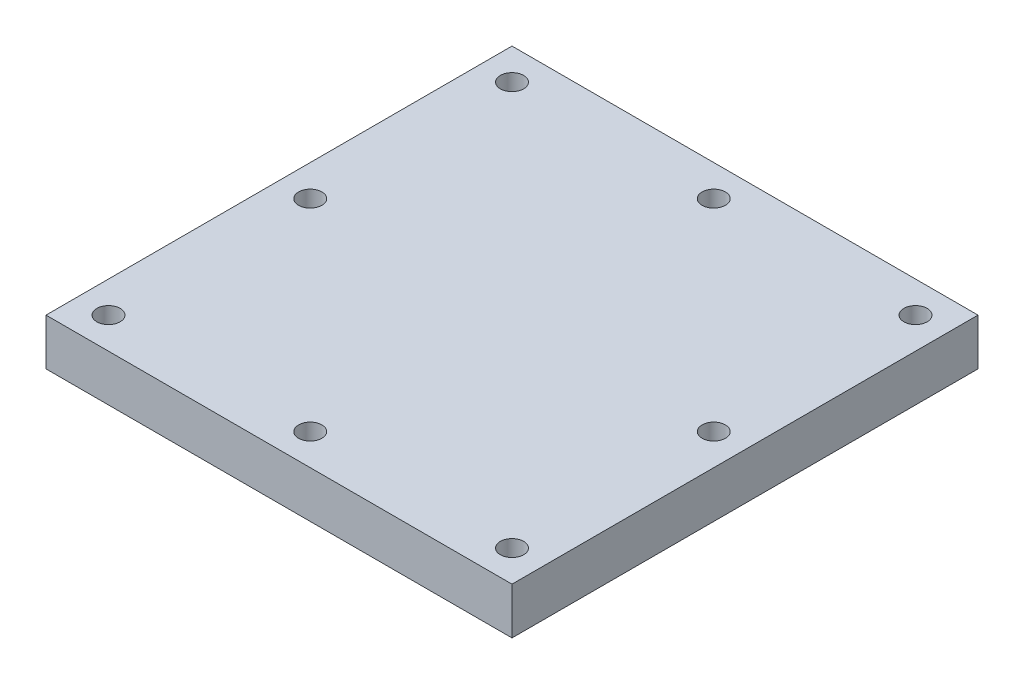
ISO-10303-21;
HEADER;
FILE_DESCRIPTION(('STEP AP214'),'2;1');
FILE_NAME('part.step','',(''),(''),'','','');
FILE_SCHEMA(('AUTOMOTIVE_DESIGN { 1 0 10303 214 1 1 1 1 }'));
ENDSEC;
DATA;
#1=APPLICATION_CONTEXT('core data for automotive mechanical design processes');
#2=APPLICATION_PROTOCOL_DEFINITION('international standard','automotive_design',2000,#1);
#3=PRODUCT_CONTEXT('',#1,'mechanical');
#4=PRODUCT('Part','Part','',(#3));
#5=PRODUCT_RELATED_PRODUCT_CATEGORY('part','',(#4));
#6=PRODUCT_DEFINITION_FORMATION('','',#4);
#7=PRODUCT_DEFINITION_CONTEXT('part definition',#1,'design');
#8=PRODUCT_DEFINITION('design','',#6,#7);
#9=PRODUCT_DEFINITION_SHAPE('','',#8);
#10=(LENGTH_UNIT() NAMED_UNIT(*) SI_UNIT(.MILLI.,.METRE.));
#11=(NAMED_UNIT(*) PLANE_ANGLE_UNIT() SI_UNIT($,.RADIAN.));
#12=(NAMED_UNIT(*) SI_UNIT($,.STERADIAN.) SOLID_ANGLE_UNIT());
#13=UNCERTAINTY_MEASURE_WITH_UNIT(LENGTH_MEASURE(1.E-05),#10,'distance_accuracy_value','');
#14=(GEOMETRIC_REPRESENTATION_CONTEXT(3) GLOBAL_UNCERTAINTY_ASSIGNED_CONTEXT((#13)) GLOBAL_UNIT_ASSIGNED_CONTEXT((#10,
#11,#12)) REPRESENTATION_CONTEXT('',''));
#15=CARTESIAN_POINT('',(0.,0.,0.));
#16=DIRECTION('',(0.,0.,1.));
#17=DIRECTION('',(1.,0.,0.));
#18=AXIS2_PLACEMENT_3D('',#15,#16,#17);
#19=CARTESIAN_POINT('',(0.,100.,0.));
#20=DIRECTION('',(0.,-1.,0.));
#21=DIRECTION('',(0.,0.,-1.));
#22=AXIS2_PLACEMENT_3D('',#19,#20,#21);
#23=PLANE('',#22);
#24=DIRECTION('',(0.,0.,-1.));
#25=VECTOR('',#24,1.);
#26=CARTESIAN_POINT('',(500.,100.,500.));
#27=LINE('',#26,#25);
#28=CARTESIAN_POINT('',(500.,100.,500.));
#29=VERTEX_POINT('',#28);
#30=CARTESIAN_POINT('',(500.,100.,-500.));
#31=VERTEX_POINT('',#30);
#32=EDGE_CURVE('E86',#29,#31,#27,.T.);
#33=ORIENTED_EDGE('',*,*,#32,.T.);
#34=DIRECTION('',(-1.,0.,0.));
#35=VECTOR('',#34,1.);
#36=CARTESIAN_POINT('',(-500.,100.,-500.));
#37=LINE('',#36,#35);
#38=CARTESIAN_POINT('',(-500.,100.,-500.));
#39=VERTEX_POINT('',#38);
#40=EDGE_CURVE('E81',#31,#39,#37,.T.);
#41=ORIENTED_EDGE('',*,*,#40,.T.);
#42=DIRECTION('',(0.,0.,1.));
#43=VECTOR('',#42,1.);
#44=CARTESIAN_POINT('',(-500.,100.,500.));
#45=LINE('',#44,#43);
#46=CARTESIAN_POINT('',(-500.,100.,500.));
#47=VERTEX_POINT('',#46);
#48=EDGE_CURVE('E84',#39,#47,#45,.T.);
#49=ORIENTED_EDGE('',*,*,#48,.T.);
#50=DIRECTION('',(1.,0.,0.));
#51=VECTOR('',#50,1.);
#52=CARTESIAN_POINT('',(-500.,100.,500.));
#53=LINE('',#52,#51);
#54=EDGE_CURVE('E51',#47,#29,#53,.T.);
#55=ORIENTED_EDGE('',*,*,#54,.T.);
#56=EDGE_LOOP('',(#33,#41,#49,#55));
#57=FACE_BOUND('',#56,.T.);
#58=CARTESIAN_POINT('',(432.951482479784,100.,-432.951482479784));
#59=DIRECTION('',(0.,1.,0.));
#60=DIRECTION('',(0.,0.,1.));
#61=AXIS2_PLACEMENT_3D('',#58,#59,#60);
#62=CIRCLE('',#61,25.);
#63=CARTESIAN_POINT('',(432.951482479784,100.,-407.951482479784));
#64=VERTEX_POINT('',#63);
#65=EDGE_CURVE('E101',#64,#64,#62,.T.);
#66=ORIENTED_EDGE('',*,*,#65,.F.);
#67=EDGE_LOOP('',(#66));
#68=FACE_BOUND('',#67,.T.);
#69=CARTESIAN_POINT('',(-432.951482479784,100.,-432.951482479784));
#70=DIRECTION('',(0.,1.,0.));
#71=DIRECTION('',(0.,0.,1.));
#72=AXIS2_PLACEMENT_3D('',#69,#70,#71);
#73=CIRCLE('',#72,25.);
#74=CARTESIAN_POINT('',(-432.951482479784,100.,-407.951482479784));
#75=VERTEX_POINT('',#74);
#76=EDGE_CURVE('E116',#75,#75,#73,.T.);
#77=ORIENTED_EDGE('',*,*,#76,.F.);
#78=EDGE_LOOP('',(#77));
#79=FACE_BOUND('',#78,.T.);
#80=CARTESIAN_POINT('',(-432.951482479784,100.,432.951482479784));
#81=DIRECTION('',(0.,1.,0.));
#82=DIRECTION('',(0.,0.,1.));
#83=AXIS2_PLACEMENT_3D('',#80,#81,#82);
#84=CIRCLE('',#83,25.);
#85=CARTESIAN_POINT('',(-432.951482479784,100.,457.951482479784));
#86=VERTEX_POINT('',#85);
#87=EDGE_CURVE('E122',#86,#86,#84,.T.);
#88=ORIENTED_EDGE('',*,*,#87,.F.);
#89=EDGE_LOOP('',(#88));
#90=FACE_BOUND('',#89,.T.);
#91=CARTESIAN_POINT('',(432.951482479784,100.,432.951482479784));
#92=DIRECTION('',(0.,1.,0.));
#93=DIRECTION('',(0.,0.,1.));
#94=AXIS2_PLACEMENT_3D('',#91,#92,#93);
#95=CIRCLE('',#94,25.);
#96=CARTESIAN_POINT('',(432.951482479784,100.,457.951482479784));
#97=VERTEX_POINT('',#96);
#98=EDGE_CURVE('E128',#97,#97,#95,.T.);
#99=ORIENTED_EDGE('',*,*,#98,.F.);
#100=EDGE_LOOP('',(#99));
#101=FACE_BOUND('',#100,.T.);
#102=CARTESIAN_POINT('',(-432.951482479785,100.,0.));
#103=DIRECTION('',(0.,1.,0.));
#104=DIRECTION('',(0.,0.,1.));
#105=AXIS2_PLACEMENT_3D('',#102,#103,#104);
#106=CIRCLE('',#105,25.);
#107=CARTESIAN_POINT('',(-432.951482479785,100.,25.));
#108=VERTEX_POINT('',#107);
#109=EDGE_CURVE('E134',#108,#108,#106,.T.);
#110=ORIENTED_EDGE('',*,*,#109,.F.);
#111=EDGE_LOOP('',(#110));
#112=FACE_BOUND('',#111,.T.);
#113=CARTESIAN_POINT('',(432.951482479784,100.,0.));
#114=DIRECTION('',(0.,1.,0.));
#115=DIRECTION('',(0.,0.,1.));
#116=AXIS2_PLACEMENT_3D('',#113,#114,#115);
#117=CIRCLE('',#116,25.);
#118=CARTESIAN_POINT('',(432.951482479784,100.,25.));
#119=VERTEX_POINT('',#118);
#120=EDGE_CURVE('E140',#119,#119,#117,.T.);
#121=ORIENTED_EDGE('',*,*,#120,.F.);
#122=EDGE_LOOP('',(#121));
#123=FACE_BOUND('',#122,.T.);
#124=CARTESIAN_POINT('',(-1.25947178244458E-13,100.,-432.951482479784));
#125=DIRECTION('',(0.,1.,0.));
#126=DIRECTION('',(0.,0.,1.));
#127=AXIS2_PLACEMENT_3D('',#124,#125,#126);
#128=CIRCLE('',#127,25.);
#129=CARTESIAN_POINT('',(-1.25947178244458E-13,100.,-407.951482479784));
#130=VERTEX_POINT('',#129);
#131=EDGE_CURVE('E146',#130,#130,#128,.T.);
#132=ORIENTED_EDGE('',*,*,#131,.F.);
#133=EDGE_LOOP('',(#132));
#134=FACE_BOUND('',#133,.T.);
#135=CARTESIAN_POINT('',(-1.11022302462516E-13,100.,432.951482479784));
#136=DIRECTION('',(0.,1.,0.));
#137=DIRECTION('',(0.,0.,1.));
#138=AXIS2_PLACEMENT_3D('',#135,#136,#137);
#139=CIRCLE('',#138,25.);
#140=CARTESIAN_POINT('',(-1.11022302462516E-13,100.,457.951482479784));
#141=VERTEX_POINT('',#140);
#142=EDGE_CURVE('E152',#141,#141,#139,.T.);
#143=ORIENTED_EDGE('',*,*,#142,.F.);
#144=EDGE_LOOP('',(#143));
#145=FACE_BOUND('',#144,.T.);
#146=ADVANCED_FACE('F34',(#57,#68,#79,#90,#101,#112,#123,#134,#145),#23,.F.);
#147=CARTESIAN_POINT('',(0.,0.,0.));
#148=DIRECTION('',(0.,-1.,0.));
#149=DIRECTION('',(0.,0.,-1.));
#150=AXIS2_PLACEMENT_3D('',#147,#148,#149);
#151=PLANE('',#150);
#152=CARTESIAN_POINT('',(-1.25947178244458E-13,0.,-432.951482479784));
#153=DIRECTION('',(0.,1.,0.));
#154=DIRECTION('',(0.,0.,1.));
#155=AXIS2_PLACEMENT_3D('',#152,#153,#154);
#156=CIRCLE('',#155,25.);
#157=CARTESIAN_POINT('',(-1.25947178244458E-13,0.,-407.951482479784));
#158=VERTEX_POINT('',#157);
#159=EDGE_CURVE('E149',#158,#158,#156,.T.);
#160=ORIENTED_EDGE('',*,*,#159,.T.);
#161=EDGE_LOOP('',(#160));
#162=FACE_BOUND('',#161,.T.);
#163=CARTESIAN_POINT('',(-432.951482479785,0.,0.));
#164=DIRECTION('',(0.,1.,0.));
#165=DIRECTION('',(0.,0.,1.));
#166=AXIS2_PLACEMENT_3D('',#163,#164,#165);
#167=CIRCLE('',#166,25.);
#168=CARTESIAN_POINT('',(-432.951482479785,0.,25.));
#169=VERTEX_POINT('',#168);
#170=EDGE_CURVE('E137',#169,#169,#167,.T.);
#171=ORIENTED_EDGE('',*,*,#170,.T.);
#172=EDGE_LOOP('',(#171));
#173=FACE_BOUND('',#172,.T.);
#174=CARTESIAN_POINT('',(-432.951482479784,0.,432.951482479784));
#175=DIRECTION('',(0.,1.,0.));
#176=DIRECTION('',(0.,0.,1.));
#177=AXIS2_PLACEMENT_3D('',#174,#175,#176);
#178=CIRCLE('',#177,25.);
#179=CARTESIAN_POINT('',(-432.951482479784,0.,457.951482479784));
#180=VERTEX_POINT('',#179);
#181=EDGE_CURVE('E125',#180,#180,#178,.T.);
#182=ORIENTED_EDGE('',*,*,#181,.T.);
#183=EDGE_LOOP('',(#182));
#184=FACE_BOUND('',#183,.T.);
#185=CARTESIAN_POINT('',(432.951482479784,0.,-432.951482479784));
#186=DIRECTION('',(0.,1.,0.));
#187=DIRECTION('',(0.,0.,1.));
#188=AXIS2_PLACEMENT_3D('',#185,#186,#187);
#189=CIRCLE('',#188,25.);
#190=CARTESIAN_POINT('',(432.951482479784,0.,-407.951482479784));
#191=VERTEX_POINT('',#190);
#192=EDGE_CURVE('E113',#191,#191,#189,.T.);
#193=ORIENTED_EDGE('',*,*,#192,.T.);
#194=EDGE_LOOP('',(#193));
#195=FACE_BOUND('',#194,.T.);
#196=DIRECTION('',(0.,0.,-1.));
#197=VECTOR('',#196,1.);
#198=CARTESIAN_POINT('',(500.,0.,500.));
#199=LINE('',#198,#197);
#200=CARTESIAN_POINT('',(500.,0.,500.));
#201=VERTEX_POINT('',#200);
#202=CARTESIAN_POINT('',(500.,0.,-500.));
#203=VERTEX_POINT('',#202);
#204=EDGE_CURVE('E98',#201,#203,#199,.T.);
#205=ORIENTED_EDGE('',*,*,#204,.F.);
#206=DIRECTION('',(1.,0.,0.));
#207=VECTOR('',#206,1.);
#208=CARTESIAN_POINT('',(-500.,0.,500.));
#209=LINE('',#208,#207);
#210=CARTESIAN_POINT('',(-500.,0.,500.));
#211=VERTEX_POINT('',#210);
#212=EDGE_CURVE('E74',#211,#201,#209,.T.);
#213=ORIENTED_EDGE('',*,*,#212,.F.);
#214=DIRECTION('',(0.,0.,1.));
#215=VECTOR('',#214,1.);
#216=CARTESIAN_POINT('',(-500.,0.,500.));
#217=LINE('',#216,#215);
#218=CARTESIAN_POINT('',(-500.,0.,-500.));
#219=VERTEX_POINT('',#218);
#220=EDGE_CURVE('E68',#219,#211,#217,.T.);
#221=ORIENTED_EDGE('',*,*,#220,.F.);
#222=DIRECTION('',(-1.,0.,0.));
#223=VECTOR('',#222,1.);
#224=CARTESIAN_POINT('',(-500.,0.,-500.));
#225=LINE('',#224,#223);
#226=EDGE_CURVE('E90',#203,#219,#225,.T.);
#227=ORIENTED_EDGE('',*,*,#226,.F.);
#228=EDGE_LOOP('',(#205,#213,#221,#227));
#229=FACE_BOUND('',#228,.T.);
#230=CARTESIAN_POINT('',(-432.951482479784,0.,-432.951482479784));
#231=DIRECTION('',(0.,1.,0.));
#232=DIRECTION('',(0.,0.,1.));
#233=AXIS2_PLACEMENT_3D('',#230,#231,#232);
#234=CIRCLE('',#233,25.);
#235=CARTESIAN_POINT('',(-432.951482479784,0.,-407.951482479784));
#236=VERTEX_POINT('',#235);
#237=EDGE_CURVE('E119',#236,#236,#234,.T.);
#238=ORIENTED_EDGE('',*,*,#237,.T.);
#239=EDGE_LOOP('',(#238));
#240=FACE_BOUND('',#239,.T.);
#241=CARTESIAN_POINT('',(432.951482479784,0.,432.951482479784));
#242=DIRECTION('',(0.,1.,0.));
#243=DIRECTION('',(0.,0.,1.));
#244=AXIS2_PLACEMENT_3D('',#241,#242,#243);
#245=CIRCLE('',#244,25.);
#246=CARTESIAN_POINT('',(432.951482479784,0.,457.951482479784));
#247=VERTEX_POINT('',#246);
#248=EDGE_CURVE('E131',#247,#247,#245,.T.);
#249=ORIENTED_EDGE('',*,*,#248,.T.);
#250=EDGE_LOOP('',(#249));
#251=FACE_BOUND('',#250,.T.);
#252=CARTESIAN_POINT('',(432.951482479784,0.,0.));
#253=DIRECTION('',(0.,1.,0.));
#254=DIRECTION('',(0.,0.,1.));
#255=AXIS2_PLACEMENT_3D('',#252,#253,#254);
#256=CIRCLE('',#255,25.);
#257=CARTESIAN_POINT('',(432.951482479784,0.,25.));
#258=VERTEX_POINT('',#257);
#259=EDGE_CURVE('E143',#258,#258,#256,.T.);
#260=ORIENTED_EDGE('',*,*,#259,.T.);
#261=EDGE_LOOP('',(#260));
#262=FACE_BOUND('',#261,.T.);
#263=CARTESIAN_POINT('',(-1.11022302462516E-13,0.,432.951482479784));
#264=DIRECTION('',(0.,1.,0.));
#265=DIRECTION('',(0.,0.,1.));
#266=AXIS2_PLACEMENT_3D('',#263,#264,#265);
#267=CIRCLE('',#266,25.);
#268=CARTESIAN_POINT('',(-1.11022302462516E-13,0.,457.951482479784));
#269=VERTEX_POINT('',#268);
#270=EDGE_CURVE('E155',#269,#269,#267,.T.);
#271=ORIENTED_EDGE('',*,*,#270,.T.);
#272=EDGE_LOOP('',(#271));
#273=FACE_BOUND('',#272,.T.);
#274=ADVANCED_FACE('F109',(#162,#173,#184,#195,#229,#240,#251,#262,#273),#151,.T.);
#275=CARTESIAN_POINT('',(500.,100.,500.));
#276=DIRECTION('',(-1.,0.,0.));
#277=DIRECTION('',(0.,0.,1.));
#278=AXIS2_PLACEMENT_3D('',#275,#276,#277);
#279=PLANE('',#278);
#280=ORIENTED_EDGE('',*,*,#204,.T.);
#281=DIRECTION('',(0.,-1.,0.));
#282=VECTOR('',#281,1.);
#283=CARTESIAN_POINT('',(500.,100.,-500.));
#284=LINE('',#283,#282);
#285=EDGE_CURVE('E11',#31,#203,#284,.T.);
#286=ORIENTED_EDGE('',*,*,#285,.F.);
#287=ORIENTED_EDGE('',*,*,#32,.F.);
#288=DIRECTION('',(0.,-1.,0.));
#289=VECTOR('',#288,1.);
#290=CARTESIAN_POINT('',(500.,100.,500.));
#291=LINE('',#290,#289);
#292=EDGE_CURVE('E94',#29,#201,#291,.T.);
#293=ORIENTED_EDGE('',*,*,#292,.T.);
#294=EDGE_LOOP('',(#280,#286,#287,#293));
#295=FACE_BOUND('',#294,.T.);
#296=ADVANCED_FACE('F36',(#295),#279,.F.);
#297=CARTESIAN_POINT('',(-500.,100.,-500.));
#298=DIRECTION('',(0.,0.,1.));
#299=DIRECTION('',(1.,0.,0.));
#300=AXIS2_PLACEMENT_3D('',#297,#298,#299);
#301=PLANE('',#300);
#302=ORIENTED_EDGE('',*,*,#226,.T.);
#303=DIRECTION('',(0.,-1.,0.));
#304=VECTOR('',#303,1.);
#305=CARTESIAN_POINT('',(-500.,100.,-500.));
#306=LINE('',#305,#304);
#307=EDGE_CURVE('E43',#39,#219,#306,.T.);
#308=ORIENTED_EDGE('',*,*,#307,.F.);
#309=ORIENTED_EDGE('',*,*,#40,.F.);
#310=ORIENTED_EDGE('',*,*,#285,.T.);
#311=EDGE_LOOP('',(#302,#308,#309,#310));
#312=FACE_BOUND('',#311,.T.);
#313=ADVANCED_FACE('F89',(#312),#301,.F.);
#314=CARTESIAN_POINT('',(-500.,100.,500.));
#315=DIRECTION('',(1.,0.,0.));
#316=DIRECTION('',(0.,0.,-1.));
#317=AXIS2_PLACEMENT_3D('',#314,#315,#316);
#318=PLANE('',#317);
#319=ORIENTED_EDGE('',*,*,#220,.T.);
#320=DIRECTION('',(0.,-1.,0.));
#321=VECTOR('',#320,1.);
#322=CARTESIAN_POINT('',(-500.,100.,500.));
#323=LINE('',#322,#321);
#324=EDGE_CURVE('E91',#47,#211,#323,.T.);
#325=ORIENTED_EDGE('',*,*,#324,.F.);
#326=ORIENTED_EDGE('',*,*,#48,.F.);
#327=ORIENTED_EDGE('',*,*,#307,.T.);
#328=EDGE_LOOP('',(#319,#325,#326,#327));
#329=FACE_BOUND('',#328,.T.);
#330=ADVANCED_FACE('F92',(#329),#318,.F.);
#331=CARTESIAN_POINT('',(-500.,100.,500.));
#332=DIRECTION('',(0.,0.,-1.));
#333=DIRECTION('',(-1.,0.,0.));
#334=AXIS2_PLACEMENT_3D('',#331,#332,#333);
#335=PLANE('',#334);
#336=ORIENTED_EDGE('',*,*,#212,.T.);
#337=ORIENTED_EDGE('',*,*,#292,.F.);
#338=ORIENTED_EDGE('',*,*,#54,.F.);
#339=ORIENTED_EDGE('',*,*,#324,.T.);
#340=EDGE_LOOP('',(#336,#337,#338,#339));
#341=FACE_BOUND('',#340,.T.);
#342=ADVANCED_FACE('F106',(#341),#335,.F.);
#343=CARTESIAN_POINT('',(432.951482479784,100.,-432.951482479784));
#344=DIRECTION('',(0.,-1.,0.));
#345=DIRECTION('',(0.,0.,-1.));
#346=AXIS2_PLACEMENT_3D('',#343,#344,#345);
#347=CYLINDRICAL_SURFACE('',#346,25.);
#348=ORIENTED_EDGE('',*,*,#65,.T.);
#349=EDGE_LOOP('',(#348));
#350=FACE_BOUND('',#349,.T.);
#351=ORIENTED_EDGE('',*,*,#192,.F.);
#352=EDGE_LOOP('',(#351));
#353=FACE_BOUND('',#352,.T.);
#354=ADVANCED_FACE('F172',(#350,#353),#347,.F.);
#355=CARTESIAN_POINT('',(-432.951482479784,100.,-432.951482479784));
#356=DIRECTION('',(0.,-1.,0.));
#357=DIRECTION('',(0.,0.,-1.));
#358=AXIS2_PLACEMENT_3D('',#355,#356,#357);
#359=CYLINDRICAL_SURFACE('',#358,25.);
#360=ORIENTED_EDGE('',*,*,#76,.T.);
#361=EDGE_LOOP('',(#360));
#362=FACE_BOUND('',#361,.T.);
#363=ORIENTED_EDGE('',*,*,#237,.F.);
#364=EDGE_LOOP('',(#363));
#365=FACE_BOUND('',#364,.T.);
#366=ADVANCED_FACE('F218',(#362,#365),#359,.F.);
#367=CARTESIAN_POINT('',(-432.951482479784,100.,432.951482479784));
#368=DIRECTION('',(0.,-1.,0.));
#369=DIRECTION('',(0.,0.,-1.));
#370=AXIS2_PLACEMENT_3D('',#367,#368,#369);
#371=CYLINDRICAL_SURFACE('',#370,25.);
#372=ORIENTED_EDGE('',*,*,#87,.T.);
#373=EDGE_LOOP('',(#372));
#374=FACE_BOUND('',#373,.T.);
#375=ORIENTED_EDGE('',*,*,#181,.F.);
#376=EDGE_LOOP('',(#375));
#377=FACE_BOUND('',#376,.T.);
#378=ADVANCED_FACE('F226',(#374,#377),#371,.F.);
#379=CARTESIAN_POINT('',(432.951482479784,100.,432.951482479784));
#380=DIRECTION('',(0.,-1.,0.));
#381=DIRECTION('',(0.,0.,-1.));
#382=AXIS2_PLACEMENT_3D('',#379,#380,#381);
#383=CYLINDRICAL_SURFACE('',#382,25.);
#384=ORIENTED_EDGE('',*,*,#98,.T.);
#385=EDGE_LOOP('',(#384));
#386=FACE_BOUND('',#385,.T.);
#387=ORIENTED_EDGE('',*,*,#248,.F.);
#388=EDGE_LOOP('',(#387));
#389=FACE_BOUND('',#388,.T.);
#390=ADVANCED_FACE('F234',(#386,#389),#383,.F.);
#391=CARTESIAN_POINT('',(-432.951482479785,100.,0.));
#392=DIRECTION('',(0.,-1.,0.));
#393=DIRECTION('',(0.,0.,-1.));
#394=AXIS2_PLACEMENT_3D('',#391,#392,#393);
#395=CYLINDRICAL_SURFACE('',#394,25.);
#396=ORIENTED_EDGE('',*,*,#109,.T.);
#397=EDGE_LOOP('',(#396));
#398=FACE_BOUND('',#397,.T.);
#399=ORIENTED_EDGE('',*,*,#170,.F.);
#400=EDGE_LOOP('',(#399));
#401=FACE_BOUND('',#400,.T.);
#402=ADVANCED_FACE('F243',(#398,#401),#395,.F.);
#403=CARTESIAN_POINT('',(432.951482479784,100.,0.));
#404=DIRECTION('',(0.,-1.,0.));
#405=DIRECTION('',(0.,0.,-1.));
#406=AXIS2_PLACEMENT_3D('',#403,#404,#405);
#407=CYLINDRICAL_SURFACE('',#406,25.);
#408=ORIENTED_EDGE('',*,*,#120,.T.);
#409=EDGE_LOOP('',(#408));
#410=FACE_BOUND('',#409,.T.);
#411=ORIENTED_EDGE('',*,*,#259,.F.);
#412=EDGE_LOOP('',(#411));
#413=FACE_BOUND('',#412,.T.);
#414=ADVANCED_FACE('F252',(#410,#413),#407,.F.);
#415=CARTESIAN_POINT('',(-1.25947178244458E-13,100.,-432.951482479784));
#416=DIRECTION('',(0.,-1.,0.));
#417=DIRECTION('',(0.,0.,-1.));
#418=AXIS2_PLACEMENT_3D('',#415,#416,#417);
#419=CYLINDRICAL_SURFACE('',#418,25.);
#420=ORIENTED_EDGE('',*,*,#131,.T.);
#421=EDGE_LOOP('',(#420));
#422=FACE_BOUND('',#421,.T.);
#423=ORIENTED_EDGE('',*,*,#159,.F.);
#424=EDGE_LOOP('',(#423));
#425=FACE_BOUND('',#424,.T.);
#426=ADVANCED_FACE('F261',(#422,#425),#419,.F.);
#427=CARTESIAN_POINT('',(-1.11022302462516E-13,100.,432.951482479784));
#428=DIRECTION('',(0.,-1.,0.));
#429=DIRECTION('',(0.,0.,-1.));
#430=AXIS2_PLACEMENT_3D('',#427,#428,#429);
#431=CYLINDRICAL_SURFACE('',#430,25.);
#432=ORIENTED_EDGE('',*,*,#142,.T.);
#433=EDGE_LOOP('',(#432));
#434=FACE_BOUND('',#433,.T.);
#435=ORIENTED_EDGE('',*,*,#270,.F.);
#436=EDGE_LOOP('',(#435));
#437=FACE_BOUND('',#436,.T.);
#438=ADVANCED_FACE('F161',(#434,#437),#431,.F.);
#439=CLOSED_SHELL('',(#146,#274,#296,#313,#330,#342,#354,#366,#378,#390,#402,#414,#426,#438));
#440=MANIFOLD_SOLID_BREP('B2',#439);
#441=ADVANCED_BREP_SHAPE_REPRESENTATION('',(#18,#440),#14);
#442=SHAPE_DEFINITION_REPRESENTATION(#9,#441);
ENDSEC;
END-ISO-10303-21;
